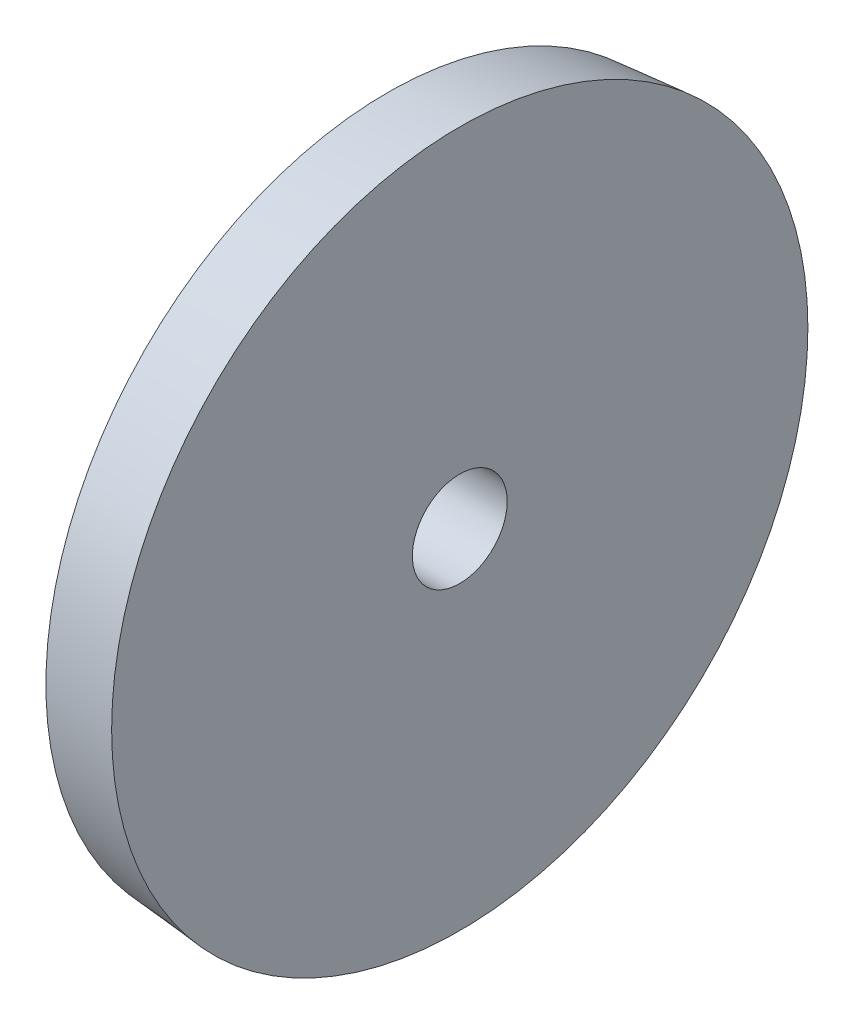
ISO-10303-21;
HEADER;
FILE_DESCRIPTION(('STEP AP214'),'2;1');
FILE_NAME('part.step','',(''),(''),'','','');
FILE_SCHEMA(('AUTOMOTIVE_DESIGN { 1 0 10303 214 1 1 1 1 }'));
ENDSEC;
DATA;
#1=APPLICATION_CONTEXT('core data for automotive mechanical design processes');
#2=APPLICATION_PROTOCOL_DEFINITION('international standard','automotive_design',2000,#1);
#3=PRODUCT_CONTEXT('',#1,'mechanical');
#4=PRODUCT('Part','Part','',(#3));
#5=PRODUCT_RELATED_PRODUCT_CATEGORY('part','',(#4));
#6=PRODUCT_DEFINITION_FORMATION('','',#4);
#7=PRODUCT_DEFINITION_CONTEXT('part definition',#1,'design');
#8=PRODUCT_DEFINITION('design','',#6,#7);
#9=PRODUCT_DEFINITION_SHAPE('','',#8);
#10=(LENGTH_UNIT() NAMED_UNIT(*) SI_UNIT(.MILLI.,.METRE.));
#11=(NAMED_UNIT(*) PLANE_ANGLE_UNIT() SI_UNIT($,.RADIAN.));
#12=(NAMED_UNIT(*) SI_UNIT($,.STERADIAN.) SOLID_ANGLE_UNIT());
#13=UNCERTAINTY_MEASURE_WITH_UNIT(LENGTH_MEASURE(1.E-05),#10,'distance_accuracy_value','');
#14=(GEOMETRIC_REPRESENTATION_CONTEXT(3) GLOBAL_UNCERTAINTY_ASSIGNED_CONTEXT((#13)) GLOBAL_UNIT_ASSIGNED_CONTEXT((#10,
#11,#12)) REPRESENTATION_CONTEXT('',''));
#15=CARTESIAN_POINT('',(0.,0.,0.));
#16=DIRECTION('',(0.,0.,1.));
#17=DIRECTION('',(1.,0.,0.));
#18=AXIS2_PLACEMENT_3D('',#15,#16,#17);
#19=CARTESIAN_POINT('',(0.,0.,0.));
#20=DIRECTION('',(1.,0.,0.));
#21=DIRECTION('',(0.,0.,-1.));
#22=AXIS2_PLACEMENT_3D('',#19,#20,#21);
#23=CYLINDRICAL_SURFACE('',#22,5.0165);
#24=CARTESIAN_POINT('',(0.,0.,0.));
#25=DIRECTION('',(1.,0.,0.));
#26=DIRECTION('',(0.,0.,-1.));
#27=AXIS2_PLACEMENT_3D('',#24,#25,#26);
#28=CIRCLE('',#27,5.0165);
#29=CARTESIAN_POINT('',(0.,0.,-5.0165));
#30=VERTEX_POINT('',#29);
#31=EDGE_CURVE('E10',#30,#30,#28,.T.);
#32=ORIENTED_EDGE('',*,*,#31,.T.);
#33=EDGE_LOOP('',(#32));
#34=FACE_BOUND('',#33,.T.);
#35=CARTESIAN_POINT('',(-7.61999999999999,0.,0.));
#36=DIRECTION('',(1.,0.,0.));
#37=DIRECTION('',(0.,0.,-1.));
#38=AXIS2_PLACEMENT_3D('',#35,#36,#37);
#39=CIRCLE('',#38,5.0165);
#40=CARTESIAN_POINT('',(-7.61999999999999,0.,-5.0165));
#41=VERTEX_POINT('',#40);
#42=EDGE_CURVE('E66',#41,#41,#39,.T.);
#43=ORIENTED_EDGE('',*,*,#42,.F.);
#44=EDGE_LOOP('',(#43));
#45=FACE_BOUND('',#44,.T.);
#46=ADVANCED_FACE('F47',(#34,#45),#23,.F.);
#47=CARTESIAN_POINT('',(0.,5.0165,0.));
#48=DIRECTION('',(1.,0.,0.));
#49=DIRECTION('',(0.,0.,-1.));
#50=AXIS2_PLACEMENT_3D('',#47,#48,#49);
#51=PLANE('',#50);
#52=CARTESIAN_POINT('',(0.,0.,0.));
#53=DIRECTION('',(1.,0.,0.));
#54=DIRECTION('',(0.,0.,-1.));
#55=AXIS2_PLACEMENT_3D('',#52,#53,#54);
#56=CIRCLE('',#55,36.83);
#57=CARTESIAN_POINT('',(0.,0.,-36.83));
#58=VERTEX_POINT('',#57);
#59=EDGE_CURVE('E54',#58,#58,#56,.T.);
#60=ORIENTED_EDGE('',*,*,#59,.T.);
#61=EDGE_LOOP('',(#60));
#62=FACE_BOUND('',#61,.T.);
#63=ORIENTED_EDGE('',*,*,#31,.F.);
#64=EDGE_LOOP('',(#63));
#65=FACE_BOUND('',#64,.T.);
#66=ADVANCED_FACE('F78',(#62,#65),#51,.T.);
#67=CARTESIAN_POINT('',(0.,0.,0.));
#68=DIRECTION('',(1.,0.,0.));
#69=DIRECTION('',(0.,0.,-1.));
#70=AXIS2_PLACEMENT_3D('',#67,#68,#69);
#71=CONICAL_SURFACE('',#70,36.83,0.0872664625997167);
#72=CARTESIAN_POINT('',(-7.61999999999999,0.,0.));
#73=DIRECTION('',(1.,0.,0.));
#74=DIRECTION('',(0.,0.,-1.));
#75=AXIS2_PLACEMENT_3D('',#72,#73,#74);
#76=CIRCLE('',#75,36.1633363839325);
#77=CARTESIAN_POINT('',(-7.61999999999999,0.,-36.1633363839325));
#78=VERTEX_POINT('',#77);
#79=EDGE_CURVE('E60',#78,#78,#76,.T.);
#80=ORIENTED_EDGE('',*,*,#79,.T.);
#81=EDGE_LOOP('',(#80));
#82=FACE_BOUND('',#81,.T.);
#83=ORIENTED_EDGE('',*,*,#59,.F.);
#84=EDGE_LOOP('',(#83));
#85=FACE_BOUND('',#84,.T.);
#86=ADVANCED_FACE('F81',(#82,#85),#71,.T.);
#87=CARTESIAN_POINT('',(-7.61999999999999,36.1633363839325,0.));
#88=DIRECTION('',(-1.,0.,0.));
#89=DIRECTION('',(0.,0.,1.));
#90=AXIS2_PLACEMENT_3D('',#87,#88,#89);
#91=PLANE('',#90);
#92=ORIENTED_EDGE('',*,*,#42,.T.);
#93=EDGE_LOOP('',(#92));
#94=FACE_BOUND('',#93,.T.);
#95=ORIENTED_EDGE('',*,*,#79,.F.);
#96=EDGE_LOOP('',(#95));
#97=FACE_BOUND('',#96,.T.);
#98=ADVANCED_FACE('F74',(#94,#97),#91,.T.);
#99=CLOSED_SHELL('',(#46,#66,#86,#98));
#100=MANIFOLD_SOLID_BREP('B2',#99);
#101=ADVANCED_BREP_SHAPE_REPRESENTATION('',(#18,#100),#14);
#102=SHAPE_DEFINITION_REPRESENTATION(#9,#101);
ENDSEC;
END-ISO-10303-21;
